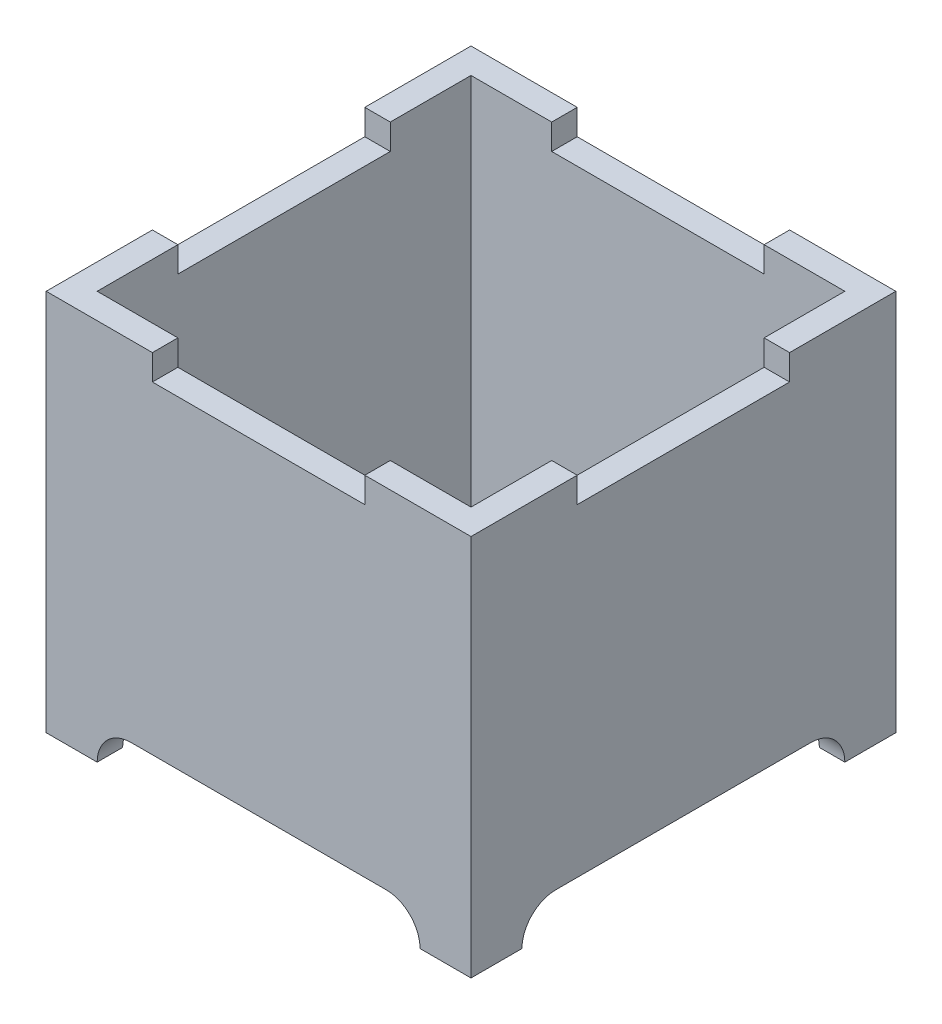
ISO-10303-21;
HEADER;
FILE_DESCRIPTION(('STEP AP214'),'2;1');
FILE_NAME('part.step','',(''),(''),'','','');
FILE_SCHEMA(('AUTOMOTIVE_DESIGN { 1 0 10303 214 1 1 1 1 }'));
ENDSEC;
DATA;
#1=APPLICATION_CONTEXT('core data for automotive mechanical design processes');
#2=APPLICATION_PROTOCOL_DEFINITION('international standard','automotive_design',2000,#1);
#3=PRODUCT_CONTEXT('',#1,'mechanical');
#4=PRODUCT('Part','Part','',(#3));
#5=PRODUCT_RELATED_PRODUCT_CATEGORY('part','',(#4));
#6=PRODUCT_DEFINITION_FORMATION('','',#4);
#7=PRODUCT_DEFINITION_CONTEXT('part definition',#1,'design');
#8=PRODUCT_DEFINITION('design','',#6,#7);
#9=PRODUCT_DEFINITION_SHAPE('','',#8);
#10=(LENGTH_UNIT() NAMED_UNIT(*) SI_UNIT(.MILLI.,.METRE.));
#11=(NAMED_UNIT(*) PLANE_ANGLE_UNIT() SI_UNIT($,.RADIAN.));
#12=(NAMED_UNIT(*) SI_UNIT($,.STERADIAN.) SOLID_ANGLE_UNIT());
#13=UNCERTAINTY_MEASURE_WITH_UNIT(LENGTH_MEASURE(1.E-05),#10,'distance_accuracy_value','');
#14=(GEOMETRIC_REPRESENTATION_CONTEXT(3) GLOBAL_UNCERTAINTY_ASSIGNED_CONTEXT((#13)) GLOBAL_UNIT_ASSIGNED_CONTEXT((#10,
#11,#12)) REPRESENTATION_CONTEXT('',''));
#15=CARTESIAN_POINT('',(0.,0.,0.));
#16=DIRECTION('',(0.,0.,1.));
#17=DIRECTION('',(1.,0.,0.));
#18=AXIS2_PLACEMENT_3D('',#15,#16,#17);
#19=CARTESIAN_POINT('',(0.,-45.,0.));
#20=DIRECTION('',(0.,-1.,0.));
#21=DIRECTION('',(0.,0.,-1.));
#22=AXIS2_PLACEMENT_3D('',#19,#20,#21);
#23=PLANE('',#22);
#24=DIRECTION('',(1.,0.,0.));
#25=VECTOR('',#24,1.);
#26=CARTESIAN_POINT('',(-7.00000000000002,-45.,-6.));
#27=LINE('',#26,#25);
#28=CARTESIAN_POINT('',(0.,-45.,-6.));
#29=VERTEX_POINT('',#28);
#30=CARTESIAN_POINT('',(3.,-45.,-6.));
#31=VERTEX_POINT('',#30);
#32=EDGE_CURVE('E304',#29,#31,#27,.T.);
#33=ORIENTED_EDGE('',*,*,#32,.T.);
#34=DIRECTION('',(0.,0.,1.));
#35=VECTOR('',#34,1.);
#36=CARTESIAN_POINT('',(3.,-45.,-3.));
#37=LINE('',#36,#35);
#38=CARTESIAN_POINT('',(3.,-45.,-3.));
#39=VERTEX_POINT('',#38);
#40=EDGE_CURVE('E535',#31,#39,#37,.T.);
#41=ORIENTED_EDGE('',*,*,#40,.T.);
#42=DIRECTION('',(1.,0.,0.));
#43=VECTOR('',#42,1.);
#44=CARTESIAN_POINT('',(3.,-45.,-3.));
#45=LINE('',#44,#43);
#46=CARTESIAN_POINT('',(6.,-45.,-3.));
#47=VERTEX_POINT('',#46);
#48=EDGE_CURVE('E540',#39,#47,#45,.T.);
#49=ORIENTED_EDGE('',*,*,#48,.T.);
#50=DIRECTION('',(0.,0.,1.));
#51=VECTOR('',#50,1.);
#52=CARTESIAN_POINT('',(6.,-45.,-57.));
#53=LINE('',#52,#51);
#54=CARTESIAN_POINT('',(6.,-45.,0.));
#55=VERTEX_POINT('',#54);
#56=EDGE_CURVE('E442',#47,#55,#53,.T.);
#57=ORIENTED_EDGE('',*,*,#56,.T.);
#58=DIRECTION('',(1.,0.,0.));
#59=VECTOR('',#58,1.);
#60=CARTESIAN_POINT('',(0.,-45.,0.));
#61=LINE('',#60,#59);
#62=CARTESIAN_POINT('',(0.,-45.,0.));
#63=VERTEX_POINT('',#62);
#64=EDGE_CURVE('E317',#63,#55,#61,.T.);
#65=ORIENTED_EDGE('',*,*,#64,.F.);
#66=DIRECTION('',(0.,0.,1.));
#67=VECTOR('',#66,1.);
#68=CARTESIAN_POINT('',(0.,-45.,0.));
#69=LINE('',#68,#67);
#70=EDGE_CURVE('E339',#29,#63,#69,.T.);
#71=ORIENTED_EDGE('',*,*,#70,.F.);
#72=EDGE_LOOP('',(#33,#41,#49,#57,#65,#71));
#73=FACE_BOUND('',#72,.T.);
#74=ADVANCED_FACE('F33',(#73),#23,.T.);
#75=CARTESIAN_POINT('',(47.,-45.,-6.));
#76=VERTEX_POINT('',#75);
#77=CARTESIAN_POINT('',(50.,-45.,-6.));
#78=VERTEX_POINT('',#77);
#79=EDGE_CURVE('E292',#76,#78,#27,.T.);
#80=ORIENTED_EDGE('',*,*,#79,.T.);
#81=DIRECTION('',(0.,0.,-1.));
#82=VECTOR('',#81,1.);
#83=CARTESIAN_POINT('',(50.,-45.,0.));
#84=LINE('',#83,#82);
#85=CARTESIAN_POINT('',(50.,-45.,0.));
#86=VERTEX_POINT('',#85);
#87=EDGE_CURVE('E301',#86,#78,#84,.T.);
#88=ORIENTED_EDGE('',*,*,#87,.F.);
#89=CARTESIAN_POINT('',(44.,-45.,0.));
#90=VERTEX_POINT('',#89);
#91=EDGE_CURVE('E571',#90,#86,#61,.T.);
#92=ORIENTED_EDGE('',*,*,#91,.F.);
#93=DIRECTION('',(0.,0.,1.));
#94=VECTOR('',#93,1.);
#95=CARTESIAN_POINT('',(44.,-45.,-57.));
#96=LINE('',#95,#94);
#97=CARTESIAN_POINT('',(44.,-45.,-3.));
#98=VERTEX_POINT('',#97);
#99=EDGE_CURVE('E443',#98,#90,#96,.T.);
#100=ORIENTED_EDGE('',*,*,#99,.F.);
#101=CARTESIAN_POINT('',(47.,-45.,-3.));
#102=VERTEX_POINT('',#101);
#103=EDGE_CURVE('E539',#98,#102,#45,.T.);
#104=ORIENTED_EDGE('',*,*,#103,.T.);
#105=DIRECTION('',(0.,0.,-1.));
#106=VECTOR('',#105,1.);
#107=CARTESIAN_POINT('',(47.,-45.,-3.));
#108=LINE('',#107,#106);
#109=EDGE_CURVE('E303',#102,#76,#108,.T.);
#110=ORIENTED_EDGE('',*,*,#109,.T.);
#111=EDGE_LOOP('',(#80,#88,#92,#100,#104,#110));
#112=FACE_BOUND('',#111,.T.);
#113=ADVANCED_FACE('F299',(#112),#23,.T.);
#114=DIRECTION('',(1.,0.,0.));
#115=VECTOR('',#114,1.);
#116=CARTESIAN_POINT('',(-7.00000000000002,-45.,-44.));
#117=LINE('',#116,#115);
#118=CARTESIAN_POINT('',(0.,-45.,-44.));
#119=VERTEX_POINT('',#118);
#120=CARTESIAN_POINT('',(3.,-45.,-44.));
#121=VERTEX_POINT('',#120);
#122=EDGE_CURVE('E428',#119,#121,#117,.T.);
#123=ORIENTED_EDGE('',*,*,#122,.F.);
#124=CARTESIAN_POINT('',(0.,-45.,-50.));
#125=VERTEX_POINT('',#124);
#126=EDGE_CURVE('E569',#125,#119,#69,.T.);
#127=ORIENTED_EDGE('',*,*,#126,.F.);
#128=DIRECTION('',(-1.,0.,0.));
#129=VECTOR('',#128,1.);
#130=CARTESIAN_POINT('',(0.,-45.,-50.));
#131=LINE('',#130,#129);
#132=CARTESIAN_POINT('',(6.,-45.,-50.));
#133=VERTEX_POINT('',#132);
#134=EDGE_CURVE('E312',#133,#125,#131,.T.);
#135=ORIENTED_EDGE('',*,*,#134,.F.);
#136=CARTESIAN_POINT('',(6.,-45.,-47.));
#137=VERTEX_POINT('',#136);
#138=EDGE_CURVE('E447',#133,#137,#53,.T.);
#139=ORIENTED_EDGE('',*,*,#138,.T.);
#140=DIRECTION('',(-1.,0.,0.));
#141=VECTOR('',#140,1.);
#142=CARTESIAN_POINT('',(3.,-45.,-47.));
#143=LINE('',#142,#141);
#144=CARTESIAN_POINT('',(3.,-45.,-47.));
#145=VERTEX_POINT('',#144);
#146=EDGE_CURVE('E530',#137,#145,#143,.T.);
#147=ORIENTED_EDGE('',*,*,#146,.T.);
#148=EDGE_CURVE('E536',#145,#121,#37,.T.);
#149=ORIENTED_EDGE('',*,*,#148,.T.);
#150=EDGE_LOOP('',(#123,#127,#135,#139,#147,#149));
#151=FACE_BOUND('',#150,.T.);
#152=ADVANCED_FACE('F629',(#151),#23,.T.);
#153=CARTESIAN_POINT('',(0.,0.,0.));
#154=DIRECTION('',(0.,-1.,0.));
#155=DIRECTION('',(0.,0.,-1.));
#156=AXIS2_PLACEMENT_3D('',#153,#154,#155);
#157=PLANE('',#156);
#158=DIRECTION('',(0.,0.,-1.));
#159=VECTOR('',#158,1.);
#160=CARTESIAN_POINT('',(47.,0.,-3.));
#161=LINE('',#160,#159);
#162=CARTESIAN_POINT('',(47.,0.,-37.5));
#163=VERTEX_POINT('',#162);
#164=CARTESIAN_POINT('',(47.,0.,-47.));
#165=VERTEX_POINT('',#164);
#166=EDGE_CURVE('E528',#163,#165,#161,.T.);
#167=ORIENTED_EDGE('',*,*,#166,.F.);
#168=DIRECTION('',(1.,0.,0.));
#169=VECTOR('',#168,1.);
#170=CARTESIAN_POINT('',(-7.00000000000002,0.,-37.5));
#171=LINE('',#170,#169);
#172=CARTESIAN_POINT('',(50.,0.,-37.5));
#173=VERTEX_POINT('',#172);
#174=EDGE_CURVE('E465',#163,#173,#171,.T.);
#175=ORIENTED_EDGE('',*,*,#174,.T.);
#176=DIRECTION('',(0.,0.,-1.));
#177=VECTOR('',#176,1.);
#178=CARTESIAN_POINT('',(50.,0.,0.));
#179=LINE('',#178,#177);
#180=CARTESIAN_POINT('',(50.,0.,-50.));
#181=VERTEX_POINT('',#180);
#182=EDGE_CURVE('E331',#173,#181,#179,.T.);
#183=ORIENTED_EDGE('',*,*,#182,.T.);
#184=DIRECTION('',(-1.,0.,0.));
#185=VECTOR('',#184,1.);
#186=CARTESIAN_POINT('',(0.,0.,-50.));
#187=LINE('',#186,#185);
#188=CARTESIAN_POINT('',(37.5,0.,-50.));
#189=VERTEX_POINT('',#188);
#190=EDGE_CURVE('E336',#181,#189,#187,.T.);
#191=ORIENTED_EDGE('',*,*,#190,.T.);
#192=DIRECTION('',(0.,0.,1.));
#193=VECTOR('',#192,1.);
#194=CARTESIAN_POINT('',(37.5,0.,-57.));
#195=LINE('',#194,#193);
#196=CARTESIAN_POINT('',(37.5,0.,-47.));
#197=VERTEX_POINT('',#196);
#198=EDGE_CURVE('E504',#189,#197,#195,.T.);
#199=ORIENTED_EDGE('',*,*,#198,.T.);
#200=DIRECTION('',(-1.,0.,0.));
#201=VECTOR('',#200,1.);
#202=CARTESIAN_POINT('',(3.,0.,-47.));
#203=LINE('',#202,#201);
#204=EDGE_CURVE('E548',#165,#197,#203,.T.);
#205=ORIENTED_EDGE('',*,*,#204,.F.);
#206=EDGE_LOOP('',(#167,#175,#183,#191,#199,#205));
#207=FACE_BOUND('',#206,.T.);
#208=ADVANCED_FACE('F639',(#207),#157,.F.);
#209=DIRECTION('',(0.,0.,1.));
#210=VECTOR('',#209,1.);
#211=CARTESIAN_POINT('',(0.,0.,0.));
#212=LINE('',#211,#210);
#213=CARTESIAN_POINT('',(0.,0.,-50.));
#214=VERTEX_POINT('',#213);
#215=CARTESIAN_POINT('',(0.,0.,-37.5));
#216=VERTEX_POINT('',#215);
#217=EDGE_CURVE('E323',#214,#216,#212,.T.);
#218=ORIENTED_EDGE('',*,*,#217,.T.);
#219=CARTESIAN_POINT('',(3.,0.,-37.5));
#220=VERTEX_POINT('',#219);
#221=EDGE_CURVE('E468',#216,#220,#171,.T.);
#222=ORIENTED_EDGE('',*,*,#221,.T.);
#223=DIRECTION('',(0.,0.,1.));
#224=VECTOR('',#223,1.);
#225=CARTESIAN_POINT('',(3.,0.,-3.));
#226=LINE('',#225,#224);
#227=CARTESIAN_POINT('',(3.,0.,-47.));
#228=VERTEX_POINT('',#227);
#229=EDGE_CURVE('E552',#228,#220,#226,.T.);
#230=ORIENTED_EDGE('',*,*,#229,.F.);
#231=CARTESIAN_POINT('',(12.5,0.,-47.));
#232=VERTEX_POINT('',#231);
#233=EDGE_CURVE('E547',#232,#228,#203,.T.);
#234=ORIENTED_EDGE('',*,*,#233,.F.);
#235=DIRECTION('',(0.,0.,1.));
#236=VECTOR('',#235,1.);
#237=CARTESIAN_POINT('',(12.5,0.,-57.));
#238=LINE('',#237,#236);
#239=CARTESIAN_POINT('',(12.5,0.,-50.));
#240=VERTEX_POINT('',#239);
#241=EDGE_CURVE('E511',#240,#232,#238,.T.);
#242=ORIENTED_EDGE('',*,*,#241,.F.);
#243=EDGE_CURVE('E335',#240,#214,#187,.T.);
#244=ORIENTED_EDGE('',*,*,#243,.T.);
#245=EDGE_LOOP('',(#218,#222,#230,#234,#242,#244));
#246=FACE_BOUND('',#245,.T.);
#247=ADVANCED_FACE('F647',(#246),#157,.F.);
#248=CARTESIAN_POINT('',(50.,0.,0.));
#249=VERTEX_POINT('',#248);
#250=CARTESIAN_POINT('',(50.,0.,-12.5));
#251=VERTEX_POINT('',#250);
#252=EDGE_CURVE('E332',#249,#251,#179,.T.);
#253=ORIENTED_EDGE('',*,*,#252,.T.);
#254=DIRECTION('',(1.,0.,0.));
#255=VECTOR('',#254,1.);
#256=CARTESIAN_POINT('',(-7.00000000000002,0.,-12.5));
#257=LINE('',#256,#255);
#258=CARTESIAN_POINT('',(47.,0.,-12.5));
#259=VERTEX_POINT('',#258);
#260=EDGE_CURVE('E464',#259,#251,#257,.T.);
#261=ORIENTED_EDGE('',*,*,#260,.F.);
#262=CARTESIAN_POINT('',(47.,0.,-3.));
#263=VERTEX_POINT('',#262);
#264=EDGE_CURVE('E544',#263,#259,#161,.T.);
#265=ORIENTED_EDGE('',*,*,#264,.F.);
#266=DIRECTION('',(1.,0.,0.));
#267=VECTOR('',#266,1.);
#268=CARTESIAN_POINT('',(3.,0.,-3.));
#269=LINE('',#268,#267);
#270=CARTESIAN_POINT('',(37.5,0.,-3.));
#271=VERTEX_POINT('',#270);
#272=EDGE_CURVE('E555',#271,#263,#269,.T.);
#273=ORIENTED_EDGE('',*,*,#272,.F.);
#274=CARTESIAN_POINT('',(37.5,0.,0.));
#275=VERTEX_POINT('',#274);
#276=EDGE_CURVE('E501',#271,#275,#195,.T.);
#277=ORIENTED_EDGE('',*,*,#276,.T.);
#278=DIRECTION('',(1.,0.,0.));
#279=VECTOR('',#278,1.);
#280=CARTESIAN_POINT('',(0.,0.,0.));
#281=LINE('',#280,#279);
#282=EDGE_CURVE('E326',#275,#249,#281,.T.);
#283=ORIENTED_EDGE('',*,*,#282,.T.);
#284=EDGE_LOOP('',(#253,#261,#265,#273,#277,#283));
#285=FACE_BOUND('',#284,.T.);
#286=ADVANCED_FACE('F640',(#285),#157,.F.);
#287=CARTESIAN_POINT('',(0.,-45.,0.));
#288=DIRECTION('',(-1.,0.,0.));
#289=DIRECTION('',(0.,0.,1.));
#290=AXIS2_PLACEMENT_3D('',#287,#288,#289);
#291=PLANE('',#290);
#292=DIRECTION('',(0.,0.,-1.));
#293=VECTOR('',#292,1.);
#294=CARTESIAN_POINT('',(0.,-41.,0.));
#295=LINE('',#294,#293);
#296=CARTESIAN_POINT('',(0.,-41.,-10.));
#297=VERTEX_POINT('',#296);
#298=CARTESIAN_POINT('',(0.,-41.,-40.));
#299=VERTEX_POINT('',#298);
#300=EDGE_CURVE('E436',#297,#299,#295,.T.);
#301=ORIENTED_EDGE('',*,*,#300,.F.);
#302=CARTESIAN_POINT('',(0.,-45.,-10.));
#303=DIRECTION('',(-1.,0.,0.));
#304=DIRECTION('',(0.,0.,1.));
#305=AXIS2_PLACEMENT_3D('',#302,#303,#304);
#306=CIRCLE('',#305,4.);
#307=EDGE_CURVE('E406',#297,#29,#306,.F.);
#308=ORIENTED_EDGE('',*,*,#307,.T.);
#309=ORIENTED_EDGE('',*,*,#70,.T.);
#310=DIRECTION('',(0.,1.,0.));
#311=VECTOR('',#310,1.);
#312=CARTESIAN_POINT('',(0.,-45.,0.));
#313=LINE('',#312,#311);
#314=CARTESIAN_POINT('',(0.,0.,0.));
#315=VERTEX_POINT('',#314);
#316=EDGE_CURVE('E322',#63,#315,#313,.T.);
#317=ORIENTED_EDGE('',*,*,#316,.T.);
#318=CARTESIAN_POINT('',(0.,0.,-12.5));
#319=VERTEX_POINT('',#318);
#320=EDGE_CURVE('E327',#319,#315,#212,.T.);
#321=ORIENTED_EDGE('',*,*,#320,.F.);
#322=DIRECTION('',(0.,1.,0.));
#323=VECTOR('',#322,1.);
#324=CARTESIAN_POINT('',(0.,-45.,-12.5));
#325=LINE('',#324,#323);
#326=CARTESIAN_POINT('',(0.,-3.,-12.5));
#327=VERTEX_POINT('',#326);
#328=EDGE_CURVE('E480',#327,#319,#325,.T.);
#329=ORIENTED_EDGE('',*,*,#328,.F.);
#330=DIRECTION('',(0.,0.,1.));
#331=VECTOR('',#330,1.);
#332=CARTESIAN_POINT('',(0.,-3.,0.));
#333=LINE('',#332,#331);
#334=CARTESIAN_POINT('',(0.,-3.,-37.5));
#335=VERTEX_POINT('',#334);
#336=EDGE_CURVE('E485',#335,#327,#333,.T.);
#337=ORIENTED_EDGE('',*,*,#336,.F.);
#338=DIRECTION('',(0.,-1.,0.));
#339=VECTOR('',#338,1.);
#340=CARTESIAN_POINT('',(0.,-45.,-37.5));
#341=LINE('',#340,#339);
#342=EDGE_CURVE('E490',#216,#335,#341,.T.);
#343=ORIENTED_EDGE('',*,*,#342,.F.);
#344=ORIENTED_EDGE('',*,*,#217,.F.);
#345=DIRECTION('',(0.,1.,0.));
#346=VECTOR('',#345,1.);
#347=CARTESIAN_POINT('',(0.,-45.,-50.));
#348=LINE('',#347,#346);
#349=EDGE_CURVE('E340',#125,#214,#348,.T.);
#350=ORIENTED_EDGE('',*,*,#349,.F.);
#351=ORIENTED_EDGE('',*,*,#126,.T.);
#352=CARTESIAN_POINT('',(0.,-45.,-40.));
#353=DIRECTION('',(-1.,0.,0.));
#354=DIRECTION('',(0.,0.,1.));
#355=AXIS2_PLACEMENT_3D('',#352,#353,#354);
#356=CIRCLE('',#355,4.);
#357=EDGE_CURVE('E410',#119,#299,#356,.F.);
#358=ORIENTED_EDGE('',*,*,#357,.T.);
#359=EDGE_LOOP('',(#301,#308,#309,#317,#321,#329,#337,#343,#344,#350,#351,#358));
#360=FACE_BOUND('',#359,.T.);
#361=ADVANCED_FACE('F579',(#360),#291,.T.);
#362=CARTESIAN_POINT('',(0.,-45.,-50.));
#363=DIRECTION('',(0.,0.,-1.));
#364=DIRECTION('',(-1.,0.,0.));
#365=AXIS2_PLACEMENT_3D('',#362,#363,#364);
#366=PLANE('',#365);
#367=DIRECTION('',(1.,0.,0.));
#368=VECTOR('',#367,1.);
#369=CARTESIAN_POINT('',(0.,-41.,-50.));
#370=LINE('',#369,#368);
#371=CARTESIAN_POINT('',(10.,-41.,-50.));
#372=VERTEX_POINT('',#371);
#373=CARTESIAN_POINT('',(40.,-41.,-50.));
#374=VERTEX_POINT('',#373);
#375=EDGE_CURVE('E453',#372,#374,#370,.T.);
#376=ORIENTED_EDGE('',*,*,#375,.F.);
#377=CARTESIAN_POINT('',(10.,-45.,-50.));
#378=DIRECTION('',(0.,0.,-1.));
#379=DIRECTION('',(-1.,0.,0.));
#380=AXIS2_PLACEMENT_3D('',#377,#378,#379);
#381=CIRCLE('',#380,4.);
#382=EDGE_CURVE('E414',#372,#133,#381,.F.);
#383=ORIENTED_EDGE('',*,*,#382,.T.);
#384=ORIENTED_EDGE('',*,*,#134,.T.);
#385=ORIENTED_EDGE('',*,*,#349,.T.);
#386=ORIENTED_EDGE('',*,*,#243,.F.);
#387=DIRECTION('',(0.,1.,0.));
#388=VECTOR('',#387,1.);
#389=CARTESIAN_POINT('',(12.5,-45.,-50.));
#390=LINE('',#389,#388);
#391=CARTESIAN_POINT('',(12.5,-3.,-50.));
#392=VERTEX_POINT('',#391);
#393=EDGE_CURVE('E516',#392,#240,#390,.T.);
#394=ORIENTED_EDGE('',*,*,#393,.F.);
#395=DIRECTION('',(-1.,0.,0.));
#396=VECTOR('',#395,1.);
#397=CARTESIAN_POINT('',(0.,-3.,-50.));
#398=LINE('',#397,#396);
#399=CARTESIAN_POINT('',(37.5,-3.,-50.));
#400=VERTEX_POINT('',#399);
#401=EDGE_CURVE('E521',#400,#392,#398,.T.);
#402=ORIENTED_EDGE('',*,*,#401,.F.);
#403=DIRECTION('',(0.,-1.,0.));
#404=VECTOR('',#403,1.);
#405=CARTESIAN_POINT('',(37.5,-45.,-50.));
#406=LINE('',#405,#404);
#407=EDGE_CURVE('E526',#189,#400,#406,.T.);
#408=ORIENTED_EDGE('',*,*,#407,.F.);
#409=ORIENTED_EDGE('',*,*,#190,.F.);
#410=DIRECTION('',(0.,1.,0.));
#411=VECTOR('',#410,1.);
#412=CARTESIAN_POINT('',(50.,-45.,-50.));
#413=LINE('',#412,#411);
#414=CARTESIAN_POINT('',(50.,-45.,-50.));
#415=VERTEX_POINT('',#414);
#416=EDGE_CURVE('E344',#415,#181,#413,.T.);
#417=ORIENTED_EDGE('',*,*,#416,.F.);
#418=CARTESIAN_POINT('',(44.,-45.,-50.));
#419=VERTEX_POINT('',#418);
#420=EDGE_CURVE('E315',#415,#419,#131,.T.);
#421=ORIENTED_EDGE('',*,*,#420,.T.);
#422=CARTESIAN_POINT('',(40.,-45.,-50.));
#423=DIRECTION('',(0.,0.,-1.));
#424=DIRECTION('',(-1.,0.,0.));
#425=AXIS2_PLACEMENT_3D('',#422,#423,#424);
#426=CIRCLE('',#425,4.);
#427=EDGE_CURVE('E394',#419,#374,#426,.F.);
#428=ORIENTED_EDGE('',*,*,#427,.T.);
#429=EDGE_LOOP('',(#376,#383,#384,#385,#386,#394,#402,#408,#409,#417,#421,#428));
#430=FACE_BOUND('',#429,.T.);
#431=ADVANCED_FACE('F703',(#430),#366,.T.);
#432=CARTESIAN_POINT('',(50.,-45.,0.));
#433=DIRECTION('',(1.,0.,0.));
#434=DIRECTION('',(0.,0.,-1.));
#435=AXIS2_PLACEMENT_3D('',#432,#433,#434);
#436=PLANE('',#435);
#437=ORIENTED_EDGE('',*,*,#87,.T.);
#438=CARTESIAN_POINT('',(50.,-45.,-10.));
#439=DIRECTION('',(1.,0.,0.));
#440=DIRECTION('',(0.,0.,-1.));
#441=AXIS2_PLACEMENT_3D('',#438,#439,#440);
#442=CIRCLE('',#441,4.);
#443=CARTESIAN_POINT('',(50.,-41.,-10.));
#444=VERTEX_POINT('',#443);
#445=EDGE_CURVE('E41',#78,#444,#442,.F.);
#446=ORIENTED_EDGE('',*,*,#445,.T.);
#447=DIRECTION('',(0.,0.,1.));
#448=VECTOR('',#447,1.);
#449=CARTESIAN_POINT('',(50.,-41.,-44.));
#450=LINE('',#449,#448);
#451=CARTESIAN_POINT('',(50.,-41.,-40.));
#452=VERTEX_POINT('',#451);
#453=EDGE_CURVE('E305',#452,#444,#450,.T.);
#454=ORIENTED_EDGE('',*,*,#453,.F.);
#455=CARTESIAN_POINT('',(50.,-45.,-40.));
#456=DIRECTION('',(1.,0.,0.));
#457=DIRECTION('',(0.,0.,-1.));
#458=AXIS2_PLACEMENT_3D('',#455,#456,#457);
#459=CIRCLE('',#458,4.);
#460=CARTESIAN_POINT('',(50.,-45.,-44.));
#461=VERTEX_POINT('',#460);
#462=EDGE_CURVE('E416',#452,#461,#459,.F.);
#463=ORIENTED_EDGE('',*,*,#462,.T.);
#464=EDGE_CURVE('E313',#461,#415,#84,.T.);
#465=ORIENTED_EDGE('',*,*,#464,.T.);
#466=ORIENTED_EDGE('',*,*,#416,.T.);
#467=ORIENTED_EDGE('',*,*,#182,.F.);
#468=DIRECTION('',(0.,1.,0.));
#469=VECTOR('',#468,1.);
#470=CARTESIAN_POINT('',(50.,0.,-37.5));
#471=LINE('',#470,#469);
#472=CARTESIAN_POINT('',(50.,-3.,-37.5));
#473=VERTEX_POINT('',#472);
#474=EDGE_CURVE('E462',#473,#173,#471,.T.);
#475=ORIENTED_EDGE('',*,*,#474,.F.);
#476=DIRECTION('',(0.,0.,-1.));
#477=VECTOR('',#476,1.);
#478=CARTESIAN_POINT('',(50.,-3.,-37.5));
#479=LINE('',#478,#477);
#480=CARTESIAN_POINT('',(50.,-3.,-12.5));
#481=VERTEX_POINT('',#480);
#482=EDGE_CURVE('E459',#481,#473,#479,.T.);
#483=ORIENTED_EDGE('',*,*,#482,.F.);
#484=DIRECTION('',(0.,-1.,0.));
#485=VECTOR('',#484,1.);
#486=CARTESIAN_POINT('',(50.,0.,-12.5));
#487=LINE('',#486,#485);
#488=EDGE_CURVE('E456',#251,#481,#487,.T.);
#489=ORIENTED_EDGE('',*,*,#488,.F.);
#490=ORIENTED_EDGE('',*,*,#252,.F.);
#491=DIRECTION('',(0.,1.,0.));
#492=VECTOR('',#491,1.);
#493=CARTESIAN_POINT('',(50.,-45.,0.));
#494=LINE('',#493,#492);
#495=EDGE_CURVE('E311',#86,#249,#494,.T.);
#496=ORIENTED_EDGE('',*,*,#495,.F.);
#497=EDGE_LOOP('',(#437,#446,#454,#463,#465,#466,#467,#475,#483,#489,#490,#496));
#498=FACE_BOUND('',#497,.T.);
#499=ADVANCED_FACE('F308',(#498),#436,.T.);
#500=CARTESIAN_POINT('',(0.,-45.,0.));
#501=DIRECTION('',(0.,0.,1.));
#502=DIRECTION('',(1.,0.,0.));
#503=AXIS2_PLACEMENT_3D('',#500,#501,#502);
#504=PLANE('',#503);
#505=ORIENTED_EDGE('',*,*,#64,.T.);
#506=CARTESIAN_POINT('',(10.,-45.,0.));
#507=DIRECTION('',(0.,0.,1.));
#508=DIRECTION('',(1.,0.,0.));
#509=AXIS2_PLACEMENT_3D('',#506,#507,#508);
#510=CIRCLE('',#509,4.);
#511=CARTESIAN_POINT('',(10.,-41.,0.));
#512=VERTEX_POINT('',#511);
#513=EDGE_CURVE('E400',#55,#512,#510,.F.);
#514=ORIENTED_EDGE('',*,*,#513,.T.);
#515=DIRECTION('',(-1.,0.,0.));
#516=VECTOR('',#515,1.);
#517=CARTESIAN_POINT('',(44.,-41.,0.));
#518=LINE('',#517,#516);
#519=CARTESIAN_POINT('',(40.,-41.,0.));
#520=VERTEX_POINT('',#519);
#521=EDGE_CURVE('E439',#520,#512,#518,.T.);
#522=ORIENTED_EDGE('',*,*,#521,.F.);
#523=CARTESIAN_POINT('',(40.,-45.,0.));
#524=DIRECTION('',(0.,0.,1.));
#525=DIRECTION('',(1.,0.,0.));
#526=AXIS2_PLACEMENT_3D('',#523,#524,#525);
#527=CIRCLE('',#526,4.);
#528=EDGE_CURVE('E396',#520,#90,#527,.F.);
#529=ORIENTED_EDGE('',*,*,#528,.T.);
#530=ORIENTED_EDGE('',*,*,#91,.T.);
#531=ORIENTED_EDGE('',*,*,#495,.T.);
#532=ORIENTED_EDGE('',*,*,#282,.F.);
#533=DIRECTION('',(0.,1.,0.));
#534=VECTOR('',#533,1.);
#535=CARTESIAN_POINT('',(37.5,0.,0.));
#536=LINE('',#535,#534);
#537=CARTESIAN_POINT('',(37.5,-3.,0.));
#538=VERTEX_POINT('',#537);
#539=EDGE_CURVE('E498',#538,#275,#536,.T.);
#540=ORIENTED_EDGE('',*,*,#539,.F.);
#541=DIRECTION('',(1.,0.,0.));
#542=VECTOR('',#541,1.);
#543=CARTESIAN_POINT('',(37.5,-3.,0.));
#544=LINE('',#543,#542);
#545=CARTESIAN_POINT('',(12.5,-3.,0.));
#546=VERTEX_POINT('',#545);
#547=EDGE_CURVE('E495',#546,#538,#544,.T.);
#548=ORIENTED_EDGE('',*,*,#547,.F.);
#549=DIRECTION('',(0.,-1.,0.));
#550=VECTOR('',#549,1.);
#551=CARTESIAN_POINT('',(12.5,0.,0.));
#552=LINE('',#551,#550);
#553=CARTESIAN_POINT('',(12.5,0.,0.));
#554=VERTEX_POINT('',#553);
#555=EDGE_CURVE('E492',#554,#546,#552,.T.);
#556=ORIENTED_EDGE('',*,*,#555,.F.);
#557=EDGE_CURVE('E328',#315,#554,#281,.T.);
#558=ORIENTED_EDGE('',*,*,#557,.F.);
#559=ORIENTED_EDGE('',*,*,#316,.F.);
#560=EDGE_LOOP('',(#505,#514,#522,#529,#530,#531,#532,#540,#548,#556,#558,#559));
#561=FACE_BOUND('',#560,.T.);
#562=ADVANCED_FACE('F588',(#561),#504,.T.);
#563=CARTESIAN_POINT('',(47.,-45.,-44.));
#564=VERTEX_POINT('',#563);
#565=EDGE_CURVE('E426',#564,#461,#117,.T.);
#566=ORIENTED_EDGE('',*,*,#565,.F.);
#567=CARTESIAN_POINT('',(47.,-45.,-47.));
#568=VERTEX_POINT('',#567);
#569=EDGE_CURVE('E531',#564,#568,#108,.T.);
#570=ORIENTED_EDGE('',*,*,#569,.T.);
#571=CARTESIAN_POINT('',(44.,-45.,-47.));
#572=VERTEX_POINT('',#571);
#573=EDGE_CURVE('E532',#568,#572,#143,.T.);
#574=ORIENTED_EDGE('',*,*,#573,.T.);
#575=EDGE_CURVE('E446',#419,#572,#96,.T.);
#576=ORIENTED_EDGE('',*,*,#575,.F.);
#577=ORIENTED_EDGE('',*,*,#420,.F.);
#578=ORIENTED_EDGE('',*,*,#464,.F.);
#579=EDGE_LOOP('',(#566,#570,#574,#576,#577,#578));
#580=FACE_BOUND('',#579,.T.);
#581=ADVANCED_FACE('F425',(#580),#23,.T.);
#582=CARTESIAN_POINT('',(3.,0.,-12.5));
#583=VERTEX_POINT('',#582);
#584=CARTESIAN_POINT('',(3.,0.,-3.));
#585=VERTEX_POINT('',#584);
#586=EDGE_CURVE('E551',#583,#585,#226,.T.);
#587=ORIENTED_EDGE('',*,*,#586,.F.);
#588=EDGE_CURVE('E475',#319,#583,#257,.T.);
#589=ORIENTED_EDGE('',*,*,#588,.F.);
#590=ORIENTED_EDGE('',*,*,#320,.T.);
#591=ORIENTED_EDGE('',*,*,#557,.T.);
#592=CARTESIAN_POINT('',(12.5,0.,-3.));
#593=VERTEX_POINT('',#592);
#594=EDGE_CURVE('E500',#593,#554,#238,.T.);
#595=ORIENTED_EDGE('',*,*,#594,.F.);
#596=EDGE_CURVE('E556',#585,#593,#269,.T.);
#597=ORIENTED_EDGE('',*,*,#596,.F.);
#598=EDGE_LOOP('',(#587,#589,#590,#591,#595,#597));
#599=FACE_BOUND('',#598,.T.);
#600=ADVANCED_FACE('F633',(#599),#157,.F.);
#601=CARTESIAN_POINT('',(47.,-45.,-3.));
#602=DIRECTION('',(1.,0.,0.));
#603=DIRECTION('',(0.,0.,-1.));
#604=AXIS2_PLACEMENT_3D('',#601,#602,#603);
#605=PLANE('',#604);
#606=ORIENTED_EDGE('',*,*,#569,.F.);
#607=CARTESIAN_POINT('',(47.,-45.,-40.));
#608=DIRECTION('',(1.,0.,0.));
#609=DIRECTION('',(0.,0.,-1.));
#610=AXIS2_PLACEMENT_3D('',#607,#608,#609);
#611=CIRCLE('',#610,4.);
#612=CARTESIAN_POINT('',(47.,-41.,-40.));
#613=VERTEX_POINT('',#612);
#614=EDGE_CURVE('E55',#564,#613,#611,.T.);
#615=ORIENTED_EDGE('',*,*,#614,.T.);
#616=DIRECTION('',(0.,0.,1.));
#617=VECTOR('',#616,1.);
#618=CARTESIAN_POINT('',(47.,-41.,-3.));
#619=LINE('',#618,#617);
#620=CARTESIAN_POINT('',(47.,-41.,-10.));
#621=VERTEX_POINT('',#620);
#622=EDGE_CURVE('E431',#613,#621,#619,.T.);
#623=ORIENTED_EDGE('',*,*,#622,.T.);
#624=CARTESIAN_POINT('',(47.,-45.,-10.));
#625=DIRECTION('',(1.,0.,0.));
#626=DIRECTION('',(0.,0.,-1.));
#627=AXIS2_PLACEMENT_3D('',#624,#625,#626);
#628=CIRCLE('',#627,4.);
#629=EDGE_CURVE('E11',#621,#76,#628,.T.);
#630=ORIENTED_EDGE('',*,*,#629,.T.);
#631=ORIENTED_EDGE('',*,*,#109,.F.);
#632=DIRECTION('',(0.,1.,0.));
#633=VECTOR('',#632,1.);
#634=CARTESIAN_POINT('',(47.,-45.,-3.));
#635=LINE('',#634,#633);
#636=EDGE_CURVE('E559',#102,#263,#635,.T.);
#637=ORIENTED_EDGE('',*,*,#636,.T.);
#638=ORIENTED_EDGE('',*,*,#264,.T.);
#639=DIRECTION('',(0.,-1.,0.));
#640=VECTOR('',#639,1.);
#641=CARTESIAN_POINT('',(47.,-45.,-12.5));
#642=LINE('',#641,#640);
#643=CARTESIAN_POINT('',(47.,-3.,-12.5));
#644=VERTEX_POINT('',#643);
#645=EDGE_CURVE('E477',#259,#644,#642,.T.);
#646=ORIENTED_EDGE('',*,*,#645,.T.);
#647=DIRECTION('',(0.,0.,-1.));
#648=VECTOR('',#647,1.);
#649=CARTESIAN_POINT('',(47.,-3.,-3.));
#650=LINE('',#649,#648);
#651=CARTESIAN_POINT('',(47.,-3.,-37.5));
#652=VERTEX_POINT('',#651);
#653=EDGE_CURVE('E482',#644,#652,#650,.T.);
#654=ORIENTED_EDGE('',*,*,#653,.T.);
#655=DIRECTION('',(0.,1.,0.));
#656=VECTOR('',#655,1.);
#657=CARTESIAN_POINT('',(47.,-45.,-37.5));
#658=LINE('',#657,#656);
#659=EDGE_CURVE('E487',#652,#163,#658,.T.);
#660=ORIENTED_EDGE('',*,*,#659,.T.);
#661=ORIENTED_EDGE('',*,*,#166,.T.);
#662=DIRECTION('',(0.,1.,0.));
#663=VECTOR('',#662,1.);
#664=CARTESIAN_POINT('',(47.,-45.,-47.));
#665=LINE('',#664,#663);
#666=EDGE_CURVE('E543',#568,#165,#665,.T.);
#667=ORIENTED_EDGE('',*,*,#666,.F.);
#668=EDGE_LOOP('',(#606,#615,#623,#630,#631,#637,#638,#646,#654,#660,#661,#667));
#669=FACE_BOUND('',#668,.T.);
#670=ADVANCED_FACE('F610',(#669),#605,.F.);
#671=CARTESIAN_POINT('',(3.,-45.,-3.));
#672=DIRECTION('',(0.,0.,1.));
#673=DIRECTION('',(1.,0.,0.));
#674=AXIS2_PLACEMENT_3D('',#671,#672,#673);
#675=PLANE('',#674);
#676=ORIENTED_EDGE('',*,*,#103,.F.);
#677=CARTESIAN_POINT('',(40.,-45.,-3.));
#678=DIRECTION('',(0.,0.,1.));
#679=DIRECTION('',(1.,0.,0.));
#680=AXIS2_PLACEMENT_3D('',#677,#678,#679);
#681=CIRCLE('',#680,4.);
#682=CARTESIAN_POINT('',(40.,-41.,-3.));
#683=VERTEX_POINT('',#682);
#684=EDGE_CURVE('E398',#98,#683,#681,.T.);
#685=ORIENTED_EDGE('',*,*,#684,.T.);
#686=DIRECTION('',(-1.,0.,0.));
#687=VECTOR('',#686,1.);
#688=CARTESIAN_POINT('',(3.,-41.,-3.));
#689=LINE('',#688,#687);
#690=CARTESIAN_POINT('',(10.,-41.,-3.));
#691=VERTEX_POINT('',#690);
#692=EDGE_CURVE('E450',#683,#691,#689,.T.);
#693=ORIENTED_EDGE('',*,*,#692,.T.);
#694=CARTESIAN_POINT('',(10.,-45.,-3.));
#695=DIRECTION('',(0.,0.,1.));
#696=DIRECTION('',(1.,0.,0.));
#697=AXIS2_PLACEMENT_3D('',#694,#695,#696);
#698=CIRCLE('',#697,4.);
#699=EDGE_CURVE('E402',#691,#47,#698,.T.);
#700=ORIENTED_EDGE('',*,*,#699,.T.);
#701=ORIENTED_EDGE('',*,*,#48,.F.);
#702=DIRECTION('',(0.,1.,0.));
#703=VECTOR('',#702,1.);
#704=CARTESIAN_POINT('',(3.,-45.,-3.));
#705=LINE('',#704,#703);
#706=EDGE_CURVE('E562',#39,#585,#705,.T.);
#707=ORIENTED_EDGE('',*,*,#706,.T.);
#708=ORIENTED_EDGE('',*,*,#596,.T.);
#709=DIRECTION('',(0.,-1.,0.));
#710=VECTOR('',#709,1.);
#711=CARTESIAN_POINT('',(12.5,-45.,-3.));
#712=LINE('',#711,#710);
#713=CARTESIAN_POINT('',(12.5,-3.,-3.));
#714=VERTEX_POINT('',#713);
#715=EDGE_CURVE('E513',#593,#714,#712,.T.);
#716=ORIENTED_EDGE('',*,*,#715,.T.);
#717=DIRECTION('',(1.,0.,0.));
#718=VECTOR('',#717,1.);
#719=CARTESIAN_POINT('',(3.,-3.,-3.));
#720=LINE('',#719,#718);
#721=CARTESIAN_POINT('',(37.5,-3.,-3.));
#722=VERTEX_POINT('',#721);
#723=EDGE_CURVE('E518',#714,#722,#720,.T.);
#724=ORIENTED_EDGE('',*,*,#723,.T.);
#725=DIRECTION('',(0.,1.,0.));
#726=VECTOR('',#725,1.);
#727=CARTESIAN_POINT('',(37.5,-45.,-3.));
#728=LINE('',#727,#726);
#729=EDGE_CURVE('E523',#722,#271,#728,.T.);
#730=ORIENTED_EDGE('',*,*,#729,.T.);
#731=ORIENTED_EDGE('',*,*,#272,.T.);
#732=ORIENTED_EDGE('',*,*,#636,.F.);
#733=EDGE_LOOP('',(#676,#685,#693,#700,#701,#707,#708,#716,#724,#730,#731,#732));
#734=FACE_BOUND('',#733,.T.);
#735=ADVANCED_FACE('F607',(#734),#675,.F.);
#736=CARTESIAN_POINT('',(3.,-45.,-3.));
#737=DIRECTION('',(-1.,0.,0.));
#738=DIRECTION('',(0.,0.,1.));
#739=AXIS2_PLACEMENT_3D('',#736,#737,#738);
#740=PLANE('',#739);
#741=ORIENTED_EDGE('',*,*,#40,.F.);
#742=CARTESIAN_POINT('',(3.,-45.,-10.));
#743=DIRECTION('',(-1.,0.,0.));
#744=DIRECTION('',(0.,0.,1.));
#745=AXIS2_PLACEMENT_3D('',#742,#743,#744);
#746=CIRCLE('',#745,4.);
#747=CARTESIAN_POINT('',(3.,-41.,-10.));
#748=VERTEX_POINT('',#747);
#749=EDGE_CURVE('E404',#31,#748,#746,.T.);
#750=ORIENTED_EDGE('',*,*,#749,.T.);
#751=DIRECTION('',(0.,0.,-1.));
#752=VECTOR('',#751,1.);
#753=CARTESIAN_POINT('',(3.,-41.,-3.));
#754=LINE('',#753,#752);
#755=CARTESIAN_POINT('',(3.,-41.,-40.));
#756=VERTEX_POINT('',#755);
#757=EDGE_CURVE('E370',#748,#756,#754,.T.);
#758=ORIENTED_EDGE('',*,*,#757,.T.);
#759=CARTESIAN_POINT('',(3.,-45.,-40.));
#760=DIRECTION('',(-1.,0.,0.));
#761=DIRECTION('',(0.,0.,1.));
#762=AXIS2_PLACEMENT_3D('',#759,#760,#761);
#763=CIRCLE('',#762,4.);
#764=EDGE_CURVE('E408',#756,#121,#763,.T.);
#765=ORIENTED_EDGE('',*,*,#764,.T.);
#766=ORIENTED_EDGE('',*,*,#148,.F.);
#767=DIRECTION('',(0.,1.,0.));
#768=VECTOR('',#767,1.);
#769=CARTESIAN_POINT('',(3.,-45.,-47.));
#770=LINE('',#769,#768);
#771=EDGE_CURVE('E565',#145,#228,#770,.T.);
#772=ORIENTED_EDGE('',*,*,#771,.T.);
#773=ORIENTED_EDGE('',*,*,#229,.T.);
#774=DIRECTION('',(0.,-1.,0.));
#775=VECTOR('',#774,1.);
#776=CARTESIAN_POINT('',(3.,-45.,-37.5));
#777=LINE('',#776,#775);
#778=CARTESIAN_POINT('',(3.,-3.,-37.5));
#779=VERTEX_POINT('',#778);
#780=EDGE_CURVE('E364',#220,#779,#777,.T.);
#781=ORIENTED_EDGE('',*,*,#780,.T.);
#782=DIRECTION('',(0.,0.,1.));
#783=VECTOR('',#782,1.);
#784=CARTESIAN_POINT('',(3.,-3.,-3.));
#785=LINE('',#784,#783);
#786=CARTESIAN_POINT('',(3.,-3.,-12.5));
#787=VERTEX_POINT('',#786);
#788=EDGE_CURVE('E361',#779,#787,#785,.T.);
#789=ORIENTED_EDGE('',*,*,#788,.T.);
#790=DIRECTION('',(0.,1.,0.));
#791=VECTOR('',#790,1.);
#792=CARTESIAN_POINT('',(3.,-45.,-12.5));
#793=LINE('',#792,#791);
#794=EDGE_CURVE('E358',#787,#583,#793,.T.);
#795=ORIENTED_EDGE('',*,*,#794,.T.);
#796=ORIENTED_EDGE('',*,*,#586,.T.);
#797=ORIENTED_EDGE('',*,*,#706,.F.);
#798=EDGE_LOOP('',(#741,#750,#758,#765,#766,#772,#773,#781,#789,#795,#796,#797));
#799=FACE_BOUND('',#798,.T.);
#800=ADVANCED_FACE('F661',(#799),#740,.F.);
#801=CARTESIAN_POINT('',(3.,-45.,-47.));
#802=DIRECTION('',(0.,0.,-1.));
#803=DIRECTION('',(-1.,0.,0.));
#804=AXIS2_PLACEMENT_3D('',#801,#802,#803);
#805=PLANE('',#804);
#806=ORIENTED_EDGE('',*,*,#146,.F.);
#807=CARTESIAN_POINT('',(10.,-45.,-47.));
#808=DIRECTION('',(0.,0.,-1.));
#809=DIRECTION('',(-1.,0.,0.));
#810=AXIS2_PLACEMENT_3D('',#807,#808,#809);
#811=CIRCLE('',#810,4.);
#812=CARTESIAN_POINT('',(10.,-41.,-47.));
#813=VERTEX_POINT('',#812);
#814=EDGE_CURVE('E412',#137,#813,#811,.T.);
#815=ORIENTED_EDGE('',*,*,#814,.T.);
#816=DIRECTION('',(1.,0.,0.));
#817=VECTOR('',#816,1.);
#818=CARTESIAN_POINT('',(3.,-41.,-47.));
#819=LINE('',#818,#817);
#820=CARTESIAN_POINT('',(40.,-41.,-47.));
#821=VERTEX_POINT('',#820);
#822=EDGE_CURVE('E367',#813,#821,#819,.T.);
#823=ORIENTED_EDGE('',*,*,#822,.T.);
#824=CARTESIAN_POINT('',(40.,-45.,-47.));
#825=DIRECTION('',(0.,0.,-1.));
#826=DIRECTION('',(-1.,0.,0.));
#827=AXIS2_PLACEMENT_3D('',#824,#825,#826);
#828=CIRCLE('',#827,4.);
#829=EDGE_CURVE('E392',#821,#572,#828,.T.);
#830=ORIENTED_EDGE('',*,*,#829,.T.);
#831=ORIENTED_EDGE('',*,*,#573,.F.);
#832=ORIENTED_EDGE('',*,*,#666,.T.);
#833=ORIENTED_EDGE('',*,*,#204,.T.);
#834=DIRECTION('',(0.,-1.,0.));
#835=VECTOR('',#834,1.);
#836=CARTESIAN_POINT('',(37.5,-45.,-47.));
#837=LINE('',#836,#835);
#838=CARTESIAN_POINT('',(37.5,-3.,-47.));
#839=VERTEX_POINT('',#838);
#840=EDGE_CURVE('E355',#197,#839,#837,.T.);
#841=ORIENTED_EDGE('',*,*,#840,.T.);
#842=DIRECTION('',(-1.,0.,0.));
#843=VECTOR('',#842,1.);
#844=CARTESIAN_POINT('',(3.,-3.,-47.));
#845=LINE('',#844,#843);
#846=CARTESIAN_POINT('',(12.5,-3.,-47.));
#847=VERTEX_POINT('',#846);
#848=EDGE_CURVE('E352',#839,#847,#845,.T.);
#849=ORIENTED_EDGE('',*,*,#848,.T.);
#850=DIRECTION('',(0.,1.,0.));
#851=VECTOR('',#850,1.);
#852=CARTESIAN_POINT('',(12.5,-45.,-47.));
#853=LINE('',#852,#851);
#854=EDGE_CURVE('E343',#847,#232,#853,.T.);
#855=ORIENTED_EDGE('',*,*,#854,.T.);
#856=ORIENTED_EDGE('',*,*,#233,.T.);
#857=ORIENTED_EDGE('',*,*,#771,.F.);
#858=EDGE_LOOP('',(#806,#815,#823,#830,#831,#832,#833,#841,#849,#855,#856,#857));
#859=FACE_BOUND('',#858,.T.);
#860=ADVANCED_FACE('F696',(#859),#805,.F.);
#861=CARTESIAN_POINT('',(12.5,0.,-57.));
#862=DIRECTION('',(-1.,0.,0.));
#863=DIRECTION('',(0.,0.,1.));
#864=AXIS2_PLACEMENT_3D('',#861,#862,#863);
#865=PLANE('',#864);
#866=ORIENTED_EDGE('',*,*,#393,.T.);
#867=ORIENTED_EDGE('',*,*,#241,.T.);
#868=ORIENTED_EDGE('',*,*,#854,.F.);
#869=DIRECTION('',(0.,0.,1.));
#870=VECTOR('',#869,1.);
#871=CARTESIAN_POINT('',(12.5,-3.,-57.));
#872=LINE('',#871,#870);
#873=EDGE_CURVE('E508',#392,#847,#872,.T.);
#874=ORIENTED_EDGE('',*,*,#873,.F.);
#875=EDGE_LOOP('',(#866,#867,#868,#874));
#876=FACE_BOUND('',#875,.T.);
#877=ADVANCED_FACE('F741',(#876),#865,.F.);
#878=CARTESIAN_POINT('',(37.5,-3.,-57.));
#879=DIRECTION('',(0.,-1.,0.));
#880=DIRECTION('',(0.,0.,-1.));
#881=AXIS2_PLACEMENT_3D('',#878,#879,#880);
#882=PLANE('',#881);
#883=ORIENTED_EDGE('',*,*,#401,.T.);
#884=ORIENTED_EDGE('',*,*,#873,.T.);
#885=ORIENTED_EDGE('',*,*,#848,.F.);
#886=DIRECTION('',(0.,0.,1.));
#887=VECTOR('',#886,1.);
#888=CARTESIAN_POINT('',(37.5,-3.,-57.));
#889=LINE('',#888,#887);
#890=EDGE_CURVE('E505',#400,#839,#889,.T.);
#891=ORIENTED_EDGE('',*,*,#890,.F.);
#892=EDGE_LOOP('',(#883,#884,#885,#891));
#893=FACE_BOUND('',#892,.T.);
#894=ADVANCED_FACE('F976',(#893),#882,.F.);
#895=CARTESIAN_POINT('',(37.5,0.,-57.));
#896=DIRECTION('',(1.,0.,0.));
#897=DIRECTION('',(0.,0.,-1.));
#898=AXIS2_PLACEMENT_3D('',#895,#896,#897);
#899=PLANE('',#898);
#900=ORIENTED_EDGE('',*,*,#407,.T.);
#901=ORIENTED_EDGE('',*,*,#890,.T.);
#902=ORIENTED_EDGE('',*,*,#840,.F.);
#903=ORIENTED_EDGE('',*,*,#198,.F.);
#904=EDGE_LOOP('',(#900,#901,#902,#903));
#905=FACE_BOUND('',#904,.T.);
#906=ADVANCED_FACE('F984',(#905),#899,.F.);
#907=EDGE_CURVE('E506',#722,#538,#889,.T.);
#908=ORIENTED_EDGE('',*,*,#907,.T.);
#909=ORIENTED_EDGE('',*,*,#539,.T.);
#910=ORIENTED_EDGE('',*,*,#276,.F.);
#911=ORIENTED_EDGE('',*,*,#729,.F.);
#912=EDGE_LOOP('',(#908,#909,#910,#911));
#913=FACE_BOUND('',#912,.T.);
#914=ADVANCED_FACE('F974',(#913),#899,.F.);
#915=EDGE_CURVE('E509',#714,#546,#872,.T.);
#916=ORIENTED_EDGE('',*,*,#915,.T.);
#917=ORIENTED_EDGE('',*,*,#547,.T.);
#918=ORIENTED_EDGE('',*,*,#907,.F.);
#919=ORIENTED_EDGE('',*,*,#723,.F.);
#920=EDGE_LOOP('',(#916,#917,#918,#919));
#921=FACE_BOUND('',#920,.T.);
#922=ADVANCED_FACE('F673',(#921),#882,.F.);
#923=ORIENTED_EDGE('',*,*,#594,.T.);
#924=ORIENTED_EDGE('',*,*,#555,.T.);
#925=ORIENTED_EDGE('',*,*,#915,.F.);
#926=ORIENTED_EDGE('',*,*,#715,.F.);
#927=EDGE_LOOP('',(#923,#924,#925,#926));
#928=FACE_BOUND('',#927,.T.);
#929=ADVANCED_FACE('F667',(#928),#865,.F.);
#930=CARTESIAN_POINT('',(-7.00000000000002,0.,-12.5));
#931=DIRECTION('',(0.,0.,1.));
#932=DIRECTION('',(1.,0.,0.));
#933=AXIS2_PLACEMENT_3D('',#930,#931,#932);
#934=PLANE('',#933);
#935=ORIENTED_EDGE('',*,*,#328,.T.);
#936=ORIENTED_EDGE('',*,*,#588,.T.);
#937=ORIENTED_EDGE('',*,*,#794,.F.);
#938=DIRECTION('',(1.,0.,0.));
#939=VECTOR('',#938,1.);
#940=CARTESIAN_POINT('',(-7.00000000000002,-3.,-12.5));
#941=LINE('',#940,#939);
#942=EDGE_CURVE('E472',#327,#787,#941,.T.);
#943=ORIENTED_EDGE('',*,*,#942,.F.);
#944=EDGE_LOOP('',(#935,#936,#937,#943));
#945=FACE_BOUND('',#944,.T.);
#946=ADVANCED_FACE('F732',(#945),#934,.F.);
#947=CARTESIAN_POINT('',(-7.00000000000002,-3.,-37.5));
#948=DIRECTION('',(0.,-1.,0.));
#949=DIRECTION('',(0.,0.,-1.));
#950=AXIS2_PLACEMENT_3D('',#947,#948,#949);
#951=PLANE('',#950);
#952=ORIENTED_EDGE('',*,*,#336,.T.);
#953=ORIENTED_EDGE('',*,*,#942,.T.);
#954=ORIENTED_EDGE('',*,*,#788,.F.);
#955=DIRECTION('',(1.,0.,0.));
#956=VECTOR('',#955,1.);
#957=CARTESIAN_POINT('',(-7.00000000000002,-3.,-37.5));
#958=LINE('',#957,#956);
#959=EDGE_CURVE('E469',#335,#779,#958,.T.);
#960=ORIENTED_EDGE('',*,*,#959,.F.);
#961=EDGE_LOOP('',(#952,#953,#954,#960));
#962=FACE_BOUND('',#961,.T.);
#963=ADVANCED_FACE('F730',(#962),#951,.F.);
#964=CARTESIAN_POINT('',(-7.00000000000002,0.,-37.5));
#965=DIRECTION('',(0.,0.,-1.));
#966=DIRECTION('',(-1.,0.,0.));
#967=AXIS2_PLACEMENT_3D('',#964,#965,#966);
#968=PLANE('',#967);
#969=ORIENTED_EDGE('',*,*,#342,.T.);
#970=ORIENTED_EDGE('',*,*,#959,.T.);
#971=ORIENTED_EDGE('',*,*,#780,.F.);
#972=ORIENTED_EDGE('',*,*,#221,.F.);
#973=EDGE_LOOP('',(#969,#970,#971,#972));
#974=FACE_BOUND('',#973,.T.);
#975=ADVANCED_FACE('F722',(#974),#968,.F.);
#976=EDGE_CURVE('E470',#652,#473,#958,.T.);
#977=ORIENTED_EDGE('',*,*,#976,.T.);
#978=ORIENTED_EDGE('',*,*,#474,.T.);
#979=ORIENTED_EDGE('',*,*,#174,.F.);
#980=ORIENTED_EDGE('',*,*,#659,.F.);
#981=EDGE_LOOP('',(#977,#978,#979,#980));
#982=FACE_BOUND('',#981,.T.);
#983=ADVANCED_FACE('F688',(#982),#968,.F.);
#984=EDGE_CURVE('E473',#644,#481,#941,.T.);
#985=ORIENTED_EDGE('',*,*,#984,.T.);
#986=ORIENTED_EDGE('',*,*,#482,.T.);
#987=ORIENTED_EDGE('',*,*,#976,.F.);
#988=ORIENTED_EDGE('',*,*,#653,.F.);
#989=EDGE_LOOP('',(#985,#986,#987,#988));
#990=FACE_BOUND('',#989,.T.);
#991=ADVANCED_FACE('F685',(#990),#951,.F.);
#992=ORIENTED_EDGE('',*,*,#260,.T.);
#993=ORIENTED_EDGE('',*,*,#488,.T.);
#994=ORIENTED_EDGE('',*,*,#984,.F.);
#995=ORIENTED_EDGE('',*,*,#645,.F.);
#996=EDGE_LOOP('',(#992,#993,#994,#995));
#997=FACE_BOUND('',#996,.T.);
#998=ADVANCED_FACE('F680',(#997),#934,.F.);
#999=CARTESIAN_POINT('',(44.,-41.,-57.));
#1000=DIRECTION('',(0.,1.,0.));
#1001=DIRECTION('',(0.,0.,1.));
#1002=AXIS2_PLACEMENT_3D('',#999,#1000,#1001);
#1003=PLANE('',#1002);
#1004=ORIENTED_EDGE('',*,*,#375,.T.);
#1005=DIRECTION('',(0.,0.,1.));
#1006=VECTOR('',#1005,1.);
#1007=CARTESIAN_POINT('',(40.,-41.,-47.));
#1008=LINE('',#1007,#1006);
#1009=EDGE_CURVE('E375',#374,#821,#1008,.T.);
#1010=ORIENTED_EDGE('',*,*,#1009,.T.);
#1011=ORIENTED_EDGE('',*,*,#822,.F.);
#1012=DIRECTION('',(0.,0.,1.));
#1013=VECTOR('',#1012,1.);
#1014=CARTESIAN_POINT('',(10.,-41.,-50.));
#1015=LINE('',#1014,#1013);
#1016=EDGE_CURVE('E373',#813,#372,#1015,.F.);
#1017=ORIENTED_EDGE('',*,*,#1016,.T.);
#1018=EDGE_LOOP('',(#1004,#1010,#1011,#1017));
#1019=FACE_BOUND('',#1018,.T.);
#1020=ADVANCED_FACE('F706',(#1019),#1003,.F.);
#1021=ORIENTED_EDGE('',*,*,#692,.F.);
#1022=DIRECTION('',(0.,0.,1.));
#1023=VECTOR('',#1022,1.);
#1024=CARTESIAN_POINT('',(40.,-41.,0.));
#1025=LINE('',#1024,#1023);
#1026=EDGE_CURVE('E380',#683,#520,#1025,.T.);
#1027=ORIENTED_EDGE('',*,*,#1026,.T.);
#1028=ORIENTED_EDGE('',*,*,#521,.T.);
#1029=DIRECTION('',(0.,0.,1.));
#1030=VECTOR('',#1029,1.);
#1031=CARTESIAN_POINT('',(10.,-41.,-3.));
#1032=LINE('',#1031,#1030);
#1033=EDGE_CURVE('E378',#512,#691,#1032,.F.);
#1034=ORIENTED_EDGE('',*,*,#1033,.T.);
#1035=EDGE_LOOP('',(#1021,#1027,#1028,#1034));
#1036=FACE_BOUND('',#1035,.T.);
#1037=ADVANCED_FACE('F599',(#1036),#1003,.F.);
#1038=CARTESIAN_POINT('',(-7.00000000000002,-41.,-44.));
#1039=DIRECTION('',(0.,1.,0.));
#1040=DIRECTION('',(0.,0.,1.));
#1041=AXIS2_PLACEMENT_3D('',#1038,#1039,#1040);
#1042=PLANE('',#1041);
#1043=ORIENTED_EDGE('',*,*,#757,.F.);
#1044=DIRECTION('',(1.,0.,0.));
#1045=VECTOR('',#1044,1.);
#1046=CARTESIAN_POINT('',(0.,-41.,-10.));
#1047=LINE('',#1046,#1045);
#1048=EDGE_CURVE('E386',#748,#297,#1047,.F.);
#1049=ORIENTED_EDGE('',*,*,#1048,.T.);
#1050=ORIENTED_EDGE('',*,*,#300,.T.);
#1051=DIRECTION('',(1.,0.,0.));
#1052=VECTOR('',#1051,1.);
#1053=CARTESIAN_POINT('',(3.,-41.,-40.));
#1054=LINE('',#1053,#1052);
#1055=EDGE_CURVE('E383',#299,#756,#1054,.T.);
#1056=ORIENTED_EDGE('',*,*,#1055,.T.);
#1057=EDGE_LOOP('',(#1043,#1049,#1050,#1056));
#1058=FACE_BOUND('',#1057,.T.);
#1059=ADVANCED_FACE('F614',(#1058),#1042,.F.);
#1060=ORIENTED_EDGE('',*,*,#622,.F.);
#1061=DIRECTION('',(1.,0.,0.));
#1062=VECTOR('',#1061,1.);
#1063=CARTESIAN_POINT('',(50.,-41.,-40.));
#1064=LINE('',#1063,#1062);
#1065=EDGE_CURVE('E389',#613,#452,#1064,.T.);
#1066=ORIENTED_EDGE('',*,*,#1065,.T.);
#1067=ORIENTED_EDGE('',*,*,#453,.T.);
#1068=DIRECTION('',(1.,0.,0.));
#1069=VECTOR('',#1068,1.);
#1070=CARTESIAN_POINT('',(47.,-41.,-10.));
#1071=LINE('',#1070,#1069);
#1072=EDGE_CURVE('E48',#444,#621,#1071,.F.);
#1073=ORIENTED_EDGE('',*,*,#1072,.T.);
#1074=EDGE_LOOP('',(#1060,#1066,#1067,#1073));
#1075=FACE_BOUND('',#1074,.T.);
#1076=ADVANCED_FACE('F611',(#1075),#1042,.F.);
#1077=CARTESIAN_POINT('',(40.,-45.,-57.));
#1078=DIRECTION('',(0.,0.,-1.));
#1079=DIRECTION('',(-1.,0.,0.));
#1080=AXIS2_PLACEMENT_3D('',#1077,#1078,#1079);
#1081=CYLINDRICAL_SURFACE('',#1080,4.);
#1082=ORIENTED_EDGE('',*,*,#427,.F.);
#1083=ORIENTED_EDGE('',*,*,#575,.T.);
#1084=ORIENTED_EDGE('',*,*,#829,.F.);
#1085=ORIENTED_EDGE('',*,*,#1009,.F.);
#1086=EDGE_LOOP('',(#1082,#1083,#1084,#1085));
#1087=FACE_BOUND('',#1086,.T.);
#1088=ADVANCED_FACE('F613',(#1087),#1081,.F.);
#1089=CARTESIAN_POINT('',(40.,-45.,-57.));
#1090=DIRECTION('',(0.,0.,-1.));
#1091=DIRECTION('',(-1.,0.,0.));
#1092=AXIS2_PLACEMENT_3D('',#1089,#1090,#1091);
#1093=CYLINDRICAL_SURFACE('',#1092,4.);
#1094=ORIENTED_EDGE('',*,*,#684,.F.);
#1095=ORIENTED_EDGE('',*,*,#99,.T.);
#1096=ORIENTED_EDGE('',*,*,#528,.F.);
#1097=ORIENTED_EDGE('',*,*,#1026,.F.);
#1098=EDGE_LOOP('',(#1094,#1095,#1096,#1097));
#1099=FACE_BOUND('',#1098,.T.);
#1100=ADVANCED_FACE('F603',(#1099),#1093,.F.);
#1101=CARTESIAN_POINT('',(10.,-45.,-57.));
#1102=DIRECTION('',(0.,0.,-1.));
#1103=DIRECTION('',(-1.,0.,0.));
#1104=AXIS2_PLACEMENT_3D('',#1101,#1102,#1103);
#1105=CYLINDRICAL_SURFACE('',#1104,4.);
#1106=ORIENTED_EDGE('',*,*,#699,.F.);
#1107=ORIENTED_EDGE('',*,*,#1033,.F.);
#1108=ORIENTED_EDGE('',*,*,#513,.F.);
#1109=ORIENTED_EDGE('',*,*,#56,.F.);
#1110=EDGE_LOOP('',(#1106,#1107,#1108,#1109));
#1111=FACE_BOUND('',#1110,.T.);
#1112=ADVANCED_FACE('F594',(#1111),#1105,.F.);
#1113=CARTESIAN_POINT('',(-7.00000000000002,-45.,-10.));
#1114=DIRECTION('',(-1.,0.,0.));
#1115=DIRECTION('',(0.,0.,1.));
#1116=AXIS2_PLACEMENT_3D('',#1113,#1114,#1115);
#1117=CYLINDRICAL_SURFACE('',#1116,4.);
#1118=ORIENTED_EDGE('',*,*,#307,.F.);
#1119=ORIENTED_EDGE('',*,*,#1048,.F.);
#1120=ORIENTED_EDGE('',*,*,#749,.F.);
#1121=ORIENTED_EDGE('',*,*,#32,.F.);
#1122=EDGE_LOOP('',(#1118,#1119,#1120,#1121));
#1123=FACE_BOUND('',#1122,.T.);
#1124=ADVANCED_FACE('F657',(#1123),#1117,.F.);
#1125=CARTESIAN_POINT('',(-7.00000000000002,-45.,-40.));
#1126=DIRECTION('',(-1.,0.,0.));
#1127=DIRECTION('',(0.,0.,1.));
#1128=AXIS2_PLACEMENT_3D('',#1125,#1126,#1127);
#1129=CYLINDRICAL_SURFACE('',#1128,4.);
#1130=ORIENTED_EDGE('',*,*,#357,.F.);
#1131=ORIENTED_EDGE('',*,*,#122,.T.);
#1132=ORIENTED_EDGE('',*,*,#764,.F.);
#1133=ORIENTED_EDGE('',*,*,#1055,.F.);
#1134=EDGE_LOOP('',(#1130,#1131,#1132,#1133));
#1135=FACE_BOUND('',#1134,.T.);
#1136=ADVANCED_FACE('F652',(#1135),#1129,.F.);
#1137=CARTESIAN_POINT('',(10.,-45.,-57.));
#1138=DIRECTION('',(0.,0.,-1.));
#1139=DIRECTION('',(-1.,0.,0.));
#1140=AXIS2_PLACEMENT_3D('',#1137,#1138,#1139);
#1141=CYLINDRICAL_SURFACE('',#1140,4.);
#1142=ORIENTED_EDGE('',*,*,#382,.F.);
#1143=ORIENTED_EDGE('',*,*,#1016,.F.);
#1144=ORIENTED_EDGE('',*,*,#814,.F.);
#1145=ORIENTED_EDGE('',*,*,#138,.F.);
#1146=EDGE_LOOP('',(#1142,#1143,#1144,#1145));
#1147=FACE_BOUND('',#1146,.T.);
#1148=ADVANCED_FACE('F710',(#1147),#1141,.F.);
#1149=CARTESIAN_POINT('',(-7.00000000000002,-45.,-40.));
#1150=DIRECTION('',(-1.,0.,0.));
#1151=DIRECTION('',(0.,0.,1.));
#1152=AXIS2_PLACEMENT_3D('',#1149,#1150,#1151);
#1153=CYLINDRICAL_SURFACE('',#1152,4.);
#1154=ORIENTED_EDGE('',*,*,#614,.F.);
#1155=ORIENTED_EDGE('',*,*,#565,.T.);
#1156=ORIENTED_EDGE('',*,*,#462,.F.);
#1157=ORIENTED_EDGE('',*,*,#1065,.F.);
#1158=EDGE_LOOP('',(#1154,#1155,#1156,#1157));
#1159=FACE_BOUND('',#1158,.T.);
#1160=ADVANCED_FACE('F427',(#1159),#1153,.F.);
#1161=CARTESIAN_POINT('',(-7.00000000000002,-45.,-10.));
#1162=DIRECTION('',(-1.,0.,0.));
#1163=DIRECTION('',(0.,0.,1.));
#1164=AXIS2_PLACEMENT_3D('',#1161,#1162,#1163);
#1165=CYLINDRICAL_SURFACE('',#1164,4.);
#1166=ORIENTED_EDGE('',*,*,#629,.F.);
#1167=ORIENTED_EDGE('',*,*,#1072,.F.);
#1168=ORIENTED_EDGE('',*,*,#445,.F.);
#1169=ORIENTED_EDGE('',*,*,#79,.F.);
#1170=EDGE_LOOP('',(#1166,#1167,#1168,#1169));
#1171=FACE_BOUND('',#1170,.T.);
#1172=ADVANCED_FACE('F35',(#1171),#1165,.F.);
#1173=CLOSED_SHELL('',(#74,#113,#152,#208,#247,#286,#361,#431,#499,#562,#581,#600,#670,#735,
#800,#860,#877,#894,#906,#914,#922,#929,#946,#963,#975,#983,#991,#998,#1020,#1037,#1059,#1076,
#1088,#1100,#1112,#1124,#1136,#1148,#1160,#1172));
#1174=MANIFOLD_SOLID_BREP('B2',#1173);
#1175=ADVANCED_BREP_SHAPE_REPRESENTATION('',(#18,#1174),#14);
#1176=SHAPE_DEFINITION_REPRESENTATION(#9,#1175);
ENDSEC;
END-ISO-10303-21;
